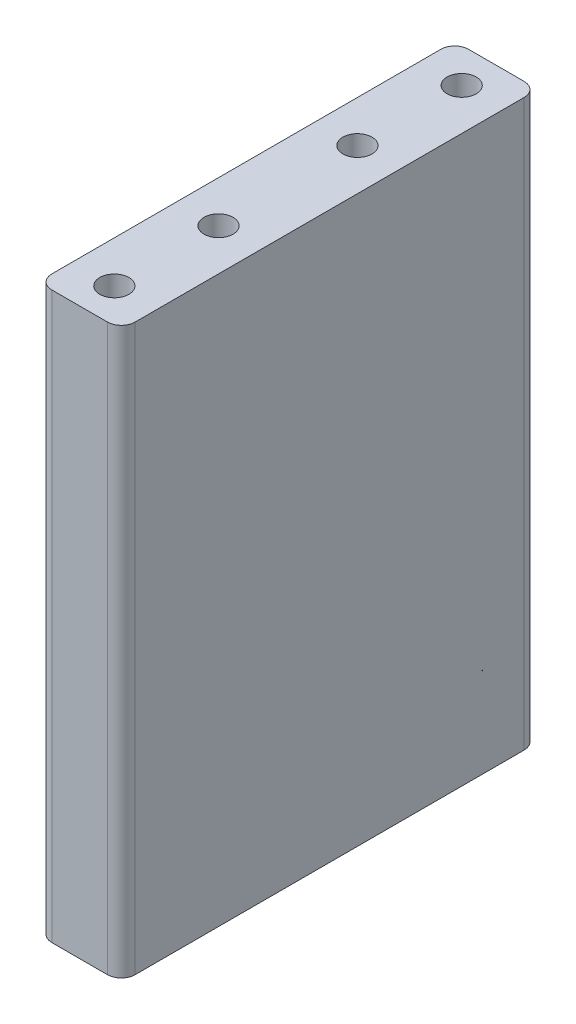
ISO-10303-21;
HEADER;
FILE_DESCRIPTION(('STEP AP214'),'2;1');
FILE_NAME('part.step','',(''),(''),'','','');
FILE_SCHEMA(('AUTOMOTIVE_DESIGN { 1 0 10303 214 1 1 1 1 }'));
ENDSEC;
DATA;
#1=APPLICATION_CONTEXT('core data for automotive mechanical design processes');
#2=APPLICATION_PROTOCOL_DEFINITION('international standard','automotive_design',2000,#1);
#3=PRODUCT_CONTEXT('',#1,'mechanical');
#4=PRODUCT('Part','Part','',(#3));
#5=PRODUCT_RELATED_PRODUCT_CATEGORY('part','',(#4));
#6=PRODUCT_DEFINITION_FORMATION('','',#4);
#7=PRODUCT_DEFINITION_CONTEXT('part definition',#1,'design');
#8=PRODUCT_DEFINITION('design','',#6,#7);
#9=PRODUCT_DEFINITION_SHAPE('','',#8);
#10=(LENGTH_UNIT() NAMED_UNIT(*) SI_UNIT(.MILLI.,.METRE.));
#11=(NAMED_UNIT(*) PLANE_ANGLE_UNIT() SI_UNIT($,.RADIAN.));
#12=(NAMED_UNIT(*) SI_UNIT($,.STERADIAN.) SOLID_ANGLE_UNIT());
#13=UNCERTAINTY_MEASURE_WITH_UNIT(LENGTH_MEASURE(1.E-05),#10,'distance_accuracy_value','');
#14=(GEOMETRIC_REPRESENTATION_CONTEXT(3) GLOBAL_UNCERTAINTY_ASSIGNED_CONTEXT((#13)) GLOBAL_UNIT_ASSIGNED_CONTEXT((#10,
#11,#12)) REPRESENTATION_CONTEXT('',''));
#15=CARTESIAN_POINT('',(0.,0.,0.));
#16=DIRECTION('',(0.,0.,1.));
#17=DIRECTION('',(1.,0.,0.));
#18=AXIS2_PLACEMENT_3D('',#15,#16,#17);
#19=CARTESIAN_POINT('',(-6.,-81.375,-30.));
#20=DIRECTION('',(0.,0.,1.));
#21=DIRECTION('',(1.,0.,0.));
#22=AXIS2_PLACEMENT_3D('',#19,#20,#21);
#23=PLANE('',#22);
#24=DIRECTION('',(1.,0.,0.));
#25=VECTOR('',#24,1.);
#26=CARTESIAN_POINT('',(-6.,-81.375,-30.));
#27=LINE('',#26,#25);
#28=CARTESIAN_POINT('',(-4.,-81.375,-30.));
#29=VERTEX_POINT('',#28);
#30=CARTESIAN_POINT('',(4.,-81.375,-30.));
#31=VERTEX_POINT('',#30);
#32=EDGE_CURVE('E125',#29,#31,#27,.T.);
#33=ORIENTED_EDGE('',*,*,#32,.F.);
#34=DIRECTION('',(0.,1.,0.));
#35=VECTOR('',#34,1.);
#36=CARTESIAN_POINT('',(-4.,0.,-30.));
#37=LINE('',#36,#35);
#38=CARTESIAN_POINT('',(-4.,0.,-30.));
#39=VERTEX_POINT('',#38);
#40=EDGE_CURVE('E109',#29,#39,#37,.T.);
#41=ORIENTED_EDGE('',*,*,#40,.T.);
#42=DIRECTION('',(1.,0.,0.));
#43=VECTOR('',#42,1.);
#44=CARTESIAN_POINT('',(-6.,0.,-30.));
#45=LINE('',#44,#43);
#46=CARTESIAN_POINT('',(4.,0.,-30.));
#47=VERTEX_POINT('',#46);
#48=EDGE_CURVE('E122',#39,#47,#45,.T.);
#49=ORIENTED_EDGE('',*,*,#48,.T.);
#50=DIRECTION('',(0.,1.,0.));
#51=VECTOR('',#50,1.);
#52=CARTESIAN_POINT('',(4.,-81.375,-30.));
#53=LINE('',#52,#51);
#54=EDGE_CURVE('E128',#47,#31,#53,.F.);
#55=ORIENTED_EDGE('',*,*,#54,.T.);
#56=EDGE_LOOP('',(#33,#41,#49,#55));
#57=FACE_BOUND('',#56,.T.);
#58=ADVANCED_FACE('F39',(#57),#23,.F.);
#59=CARTESIAN_POINT('',(6.,-81.375,-30.));
#60=DIRECTION('',(-1.,0.,0.));
#61=DIRECTION('',(0.,0.,1.));
#62=AXIS2_PLACEMENT_3D('',#59,#60,#61);
#63=PLANE('',#62);
#64=DIRECTION('',(0.,0.,1.));
#65=VECTOR('',#64,1.);
#66=CARTESIAN_POINT('',(6.,-81.375,-30.));
#67=LINE('',#66,#65);
#68=CARTESIAN_POINT('',(6.,-81.375,-28.));
#69=VERTEX_POINT('',#68);
#70=CARTESIAN_POINT('',(6.,-81.375,28.));
#71=VERTEX_POINT('',#70);
#72=EDGE_CURVE('E201',#69,#71,#67,.T.);
#73=ORIENTED_EDGE('',*,*,#72,.F.);
#74=DIRECTION('',(0.,1.,0.));
#75=VECTOR('',#74,1.);
#76=CARTESIAN_POINT('',(6.,-81.375,-28.));
#77=LINE('',#76,#75);
#78=CARTESIAN_POINT('',(6.,0.,-28.));
#79=VERTEX_POINT('',#78);
#80=EDGE_CURVE('E182',#69,#79,#77,.T.);
#81=ORIENTED_EDGE('',*,*,#80,.T.);
#82=DIRECTION('',(0.,0.,1.));
#83=VECTOR('',#82,1.);
#84=CARTESIAN_POINT('',(6.,0.,-30.));
#85=LINE('',#84,#83);
#86=CARTESIAN_POINT('',(6.,0.,28.));
#87=VERTEX_POINT('',#86);
#88=EDGE_CURVE('E133',#79,#87,#85,.T.);
#89=ORIENTED_EDGE('',*,*,#88,.T.);
#90=DIRECTION('',(0.,1.,0.));
#91=VECTOR('',#90,1.);
#92=CARTESIAN_POINT('',(6.,-81.375,28.));
#93=LINE('',#92,#91);
#94=EDGE_CURVE('E179',#87,#71,#93,.F.);
#95=ORIENTED_EDGE('',*,*,#94,.T.);
#96=EDGE_LOOP('',(#73,#81,#89,#95));
#97=FACE_BOUND('',#96,.T.);
#98=ADVANCED_FACE('F265',(#97),#63,.F.);
#99=CARTESIAN_POINT('',(-6.,-81.375,30.));
#100=DIRECTION('',(0.,0.,1.));
#101=DIRECTION('',(1.,0.,0.));
#102=AXIS2_PLACEMENT_3D('',#99,#100,#101);
#103=PLANE('',#102);
#104=DIRECTION('',(1.,0.,0.));
#105=VECTOR('',#104,1.);
#106=CARTESIAN_POINT('',(-6.,0.,30.));
#107=LINE('',#106,#105);
#108=CARTESIAN_POINT('',(-4.,0.,30.));
#109=VERTEX_POINT('',#108);
#110=CARTESIAN_POINT('',(4.,0.,30.));
#111=VERTEX_POINT('',#110);
#112=EDGE_CURVE('E139',#109,#111,#107,.T.);
#113=ORIENTED_EDGE('',*,*,#112,.F.);
#114=DIRECTION('',(0.,1.,0.));
#115=VECTOR('',#114,1.);
#116=CARTESIAN_POINT('',(-4.,-81.375,30.));
#117=LINE('',#116,#115);
#118=CARTESIAN_POINT('',(-4.,-81.375,30.));
#119=VERTEX_POINT('',#118);
#120=EDGE_CURVE('E11',#109,#119,#117,.F.);
#121=ORIENTED_EDGE('',*,*,#120,.T.);
#122=DIRECTION('',(1.,0.,0.));
#123=VECTOR('',#122,1.);
#124=CARTESIAN_POINT('',(-6.,-81.375,30.));
#125=LINE('',#124,#123);
#126=CARTESIAN_POINT('',(4.,-81.375,30.));
#127=VERTEX_POINT('',#126);
#128=EDGE_CURVE('E189',#119,#127,#125,.T.);
#129=ORIENTED_EDGE('',*,*,#128,.T.);
#130=DIRECTION('',(0.,1.,0.));
#131=VECTOR('',#130,1.);
#132=CARTESIAN_POINT('',(4.,0.,30.));
#133=LINE('',#132,#131);
#134=EDGE_CURVE('E48',#127,#111,#133,.T.);
#135=ORIENTED_EDGE('',*,*,#134,.T.);
#136=EDGE_LOOP('',(#113,#121,#129,#135));
#137=FACE_BOUND('',#136,.T.);
#138=ADVANCED_FACE('F188',(#137),#103,.T.);
#139=CARTESIAN_POINT('',(-6.,-81.375,-30.));
#140=DIRECTION('',(-1.,0.,0.));
#141=DIRECTION('',(0.,0.,1.));
#142=AXIS2_PLACEMENT_3D('',#139,#140,#141);
#143=PLANE('',#142);
#144=DIRECTION('',(0.,0.,1.));
#145=VECTOR('',#144,1.);
#146=CARTESIAN_POINT('',(-6.,0.,-30.));
#147=LINE('',#146,#145);
#148=CARTESIAN_POINT('',(-6.,0.,-28.));
#149=VERTEX_POINT('',#148);
#150=CARTESIAN_POINT('',(-6.,0.,28.));
#151=VERTEX_POINT('',#150);
#152=EDGE_CURVE('E151',#149,#151,#147,.T.);
#153=ORIENTED_EDGE('',*,*,#152,.F.);
#154=DIRECTION('',(0.,1.,0.));
#155=VECTOR('',#154,1.);
#156=CARTESIAN_POINT('',(-6.,-81.375,-28.));
#157=LINE('',#156,#155);
#158=CARTESIAN_POINT('',(-6.,-81.375,-28.));
#159=VERTEX_POINT('',#158);
#160=EDGE_CURVE('E110',#149,#159,#157,.F.);
#161=ORIENTED_EDGE('',*,*,#160,.T.);
#162=DIRECTION('',(0.,0.,1.));
#163=VECTOR('',#162,1.);
#164=CARTESIAN_POINT('',(-6.,-81.375,-30.));
#165=LINE('',#164,#163);
#166=CARTESIAN_POINT('',(-6.,-81.375,28.));
#167=VERTEX_POINT('',#166);
#168=EDGE_CURVE('E145',#159,#167,#165,.T.);
#169=ORIENTED_EDGE('',*,*,#168,.T.);
#170=DIRECTION('',(0.,1.,0.));
#171=VECTOR('',#170,1.);
#172=CARTESIAN_POINT('',(-6.,-81.375,28.));
#173=LINE('',#172,#171);
#174=EDGE_CURVE('E116',#167,#151,#173,.T.);
#175=ORIENTED_EDGE('',*,*,#174,.T.);
#176=EDGE_LOOP('',(#153,#161,#169,#175));
#177=FACE_BOUND('',#176,.T.);
#178=ADVANCED_FACE('F197',(#177),#143,.T.);
#179=CARTESIAN_POINT('',(0.,-81.375,0.));
#180=DIRECTION('',(0.,-1.,0.));
#181=DIRECTION('',(0.,0.,-1.));
#182=AXIS2_PLACEMENT_3D('',#179,#180,#181);
#183=PLANE('',#182);
#184=CARTESIAN_POINT('',(0.,-81.375,-10.));
#185=DIRECTION('',(0.,-1.,0.));
#186=DIRECTION('',(0.,0.,-1.));
#187=AXIS2_PLACEMENT_3D('',#184,#185,#186);
#188=CIRCLE('',#187,2.09999999999999);
#189=CARTESIAN_POINT('',(0.,-81.375,-12.1));
#190=VERTEX_POINT('',#189);
#191=EDGE_CURVE('E226',#190,#190,#188,.T.);
#192=ORIENTED_EDGE('',*,*,#191,.F.);
#193=EDGE_LOOP('',(#192));
#194=FACE_BOUND('',#193,.T.);
#195=CARTESIAN_POINT('',(0.,-81.375,10.));
#196=DIRECTION('',(0.,-1.,0.));
#197=DIRECTION('',(0.,0.,-1.));
#198=AXIS2_PLACEMENT_3D('',#195,#196,#197);
#199=CIRCLE('',#198,2.09999999999999);
#200=CARTESIAN_POINT('',(0.,-81.375,7.90000000000002));
#201=VERTEX_POINT('',#200);
#202=EDGE_CURVE('E218',#201,#201,#199,.T.);
#203=ORIENTED_EDGE('',*,*,#202,.F.);
#204=EDGE_LOOP('',(#203));
#205=FACE_BOUND('',#204,.T.);
#206=CARTESIAN_POINT('',(0.,-81.375,-25.));
#207=DIRECTION('',(0.,-1.,0.));
#208=DIRECTION('',(0.,0.,-1.));
#209=AXIS2_PLACEMENT_3D('',#206,#207,#208);
#210=CIRCLE('',#209,2.09999999999999);
#211=CARTESIAN_POINT('',(0.,-81.375,-27.1));
#212=VERTEX_POINT('',#211);
#213=EDGE_CURVE('E210',#212,#212,#210,.T.);
#214=ORIENTED_EDGE('',*,*,#213,.F.);
#215=EDGE_LOOP('',(#214));
#216=FACE_BOUND('',#215,.T.);
#217=CARTESIAN_POINT('',(0.,-81.375,25.));
#218=DIRECTION('',(0.,-1.,0.));
#219=DIRECTION('',(0.,0.,-1.));
#220=AXIS2_PLACEMENT_3D('',#217,#218,#219);
#221=CIRCLE('',#220,2.09999999999999);
#222=CARTESIAN_POINT('',(0.,-81.375,22.9));
#223=VERTEX_POINT('',#222);
#224=EDGE_CURVE('E134',#223,#223,#221,.T.);
#225=ORIENTED_EDGE('',*,*,#224,.F.);
#226=EDGE_LOOP('',(#225));
#227=FACE_BOUND('',#226,.T.);
#228=ORIENTED_EDGE('',*,*,#168,.F.);
#229=CARTESIAN_POINT('',(-4.,-81.375,-28.));
#230=DIRECTION('',(0.,-1.,0.));
#231=DIRECTION('',(0.,0.,-1.));
#232=AXIS2_PLACEMENT_3D('',#229,#230,#231);
#233=CIRCLE('',#232,2.);
#234=EDGE_CURVE('E176',#159,#29,#233,.T.);
#235=ORIENTED_EDGE('',*,*,#234,.T.);
#236=ORIENTED_EDGE('',*,*,#32,.T.);
#237=CARTESIAN_POINT('',(4.,-81.375,-28.));
#238=DIRECTION('',(0.,-1.,0.));
#239=DIRECTION('',(0.,0.,-1.));
#240=AXIS2_PLACEMENT_3D('',#237,#238,#239);
#241=CIRCLE('',#240,2.);
#242=EDGE_CURVE('E173',#31,#69,#241,.T.);
#243=ORIENTED_EDGE('',*,*,#242,.T.);
#244=ORIENTED_EDGE('',*,*,#72,.T.);
#245=CARTESIAN_POINT('',(4.,-81.375,28.));
#246=DIRECTION('',(0.,-1.,0.));
#247=DIRECTION('',(0.,0.,-1.));
#248=AXIS2_PLACEMENT_3D('',#245,#246,#247);
#249=CIRCLE('',#248,2.);
#250=EDGE_CURVE('E55',#71,#127,#249,.T.);
#251=ORIENTED_EDGE('',*,*,#250,.T.);
#252=ORIENTED_EDGE('',*,*,#128,.F.);
#253=CARTESIAN_POINT('',(-4.,-81.375,28.));
#254=DIRECTION('',(0.,-1.,0.));
#255=DIRECTION('',(0.,0.,-1.));
#256=AXIS2_PLACEMENT_3D('',#253,#254,#255);
#257=CIRCLE('',#256,2.);
#258=EDGE_CURVE('E170',#119,#167,#257,.T.);
#259=ORIENTED_EDGE('',*,*,#258,.T.);
#260=EDGE_LOOP('',(#228,#235,#236,#243,#244,#251,#252,#259));
#261=FACE_BOUND('',#260,.T.);
#262=ADVANCED_FACE('F241',(#194,#205,#216,#227,#261),#183,.T.);
#263=CARTESIAN_POINT('',(0.,0.,0.));
#264=DIRECTION('',(0.,-1.,0.));
#265=DIRECTION('',(0.,0.,-1.));
#266=AXIS2_PLACEMENT_3D('',#263,#264,#265);
#267=PLANE('',#266);
#268=CARTESIAN_POINT('',(0.,0.,-10.));
#269=DIRECTION('',(0.,1.,0.));
#270=DIRECTION('',(0.,0.,1.));
#271=AXIS2_PLACEMENT_3D('',#268,#269,#270);
#272=CIRCLE('',#271,2.09999999999999);
#273=CARTESIAN_POINT('',(0.,0.,-7.90000000000001));
#274=VERTEX_POINT('',#273);
#275=EDGE_CURVE('E230',#274,#274,#272,.T.);
#276=ORIENTED_EDGE('',*,*,#275,.F.);
#277=EDGE_LOOP('',(#276));
#278=FACE_BOUND('',#277,.T.);
#279=CARTESIAN_POINT('',(0.,0.,10.));
#280=DIRECTION('',(0.,1.,0.));
#281=DIRECTION('',(0.,0.,1.));
#282=AXIS2_PLACEMENT_3D('',#279,#280,#281);
#283=CIRCLE('',#282,2.09999999999999);
#284=CARTESIAN_POINT('',(0.,0.,12.1));
#285=VERTEX_POINT('',#284);
#286=EDGE_CURVE('E222',#285,#285,#283,.T.);
#287=ORIENTED_EDGE('',*,*,#286,.F.);
#288=EDGE_LOOP('',(#287));
#289=FACE_BOUND('',#288,.T.);
#290=CARTESIAN_POINT('',(0.,0.,-25.));
#291=DIRECTION('',(0.,1.,0.));
#292=DIRECTION('',(0.,0.,1.));
#293=AXIS2_PLACEMENT_3D('',#290,#291,#292);
#294=CIRCLE('',#293,2.09999999999999);
#295=CARTESIAN_POINT('',(0.,0.,-22.9));
#296=VERTEX_POINT('',#295);
#297=EDGE_CURVE('E214',#296,#296,#294,.T.);
#298=ORIENTED_EDGE('',*,*,#297,.F.);
#299=EDGE_LOOP('',(#298));
#300=FACE_BOUND('',#299,.T.);
#301=CARTESIAN_POINT('',(0.,0.,25.));
#302=DIRECTION('',(0.,1.,0.));
#303=DIRECTION('',(0.,0.,1.));
#304=AXIS2_PLACEMENT_3D('',#301,#302,#303);
#305=CIRCLE('',#304,2.09999999999999);
#306=CARTESIAN_POINT('',(0.,0.,27.1));
#307=VERTEX_POINT('',#306);
#308=EDGE_CURVE('E142',#307,#307,#305,.T.);
#309=ORIENTED_EDGE('',*,*,#308,.F.);
#310=EDGE_LOOP('',(#309));
#311=FACE_BOUND('',#310,.T.);
#312=ORIENTED_EDGE('',*,*,#48,.F.);
#313=CARTESIAN_POINT('',(-4.,0.,-28.));
#314=DIRECTION('',(0.,-1.,0.));
#315=DIRECTION('',(0.,0.,-1.));
#316=AXIS2_PLACEMENT_3D('',#313,#314,#315);
#317=CIRCLE('',#316,2.);
#318=EDGE_CURVE('E105',#39,#149,#317,.F.);
#319=ORIENTED_EDGE('',*,*,#318,.T.);
#320=ORIENTED_EDGE('',*,*,#152,.T.);
#321=CARTESIAN_POINT('',(-4.,0.,28.));
#322=DIRECTION('',(0.,-1.,0.));
#323=DIRECTION('',(0.,0.,-1.));
#324=AXIS2_PLACEMENT_3D('',#321,#322,#323);
#325=CIRCLE('',#324,2.);
#326=EDGE_CURVE('E158',#151,#109,#325,.F.);
#327=ORIENTED_EDGE('',*,*,#326,.T.);
#328=ORIENTED_EDGE('',*,*,#112,.T.);
#329=CARTESIAN_POINT('',(4.,0.,28.));
#330=DIRECTION('',(0.,-1.,0.));
#331=DIRECTION('',(0.,0.,-1.));
#332=AXIS2_PLACEMENT_3D('',#329,#330,#331);
#333=CIRCLE('',#332,2.);
#334=EDGE_CURVE('E127',#111,#87,#333,.F.);
#335=ORIENTED_EDGE('',*,*,#334,.T.);
#336=ORIENTED_EDGE('',*,*,#88,.F.);
#337=CARTESIAN_POINT('',(4.,0.,-28.));
#338=DIRECTION('',(0.,-1.,0.));
#339=DIRECTION('',(0.,0.,-1.));
#340=AXIS2_PLACEMENT_3D('',#337,#338,#339);
#341=CIRCLE('',#340,2.);
#342=EDGE_CURVE('E117',#79,#47,#341,.F.);
#343=ORIENTED_EDGE('',*,*,#342,.T.);
#344=EDGE_LOOP('',(#312,#319,#320,#327,#328,#335,#336,#343));
#345=FACE_BOUND('',#344,.T.);
#346=ADVANCED_FACE('F130',(#278,#289,#300,#311,#345),#267,.F.);
#347=CARTESIAN_POINT('',(0.,0.,25.));
#348=DIRECTION('',(0.,1.,0.));
#349=DIRECTION('',(0.,0.,1.));
#350=AXIS2_PLACEMENT_3D('',#347,#348,#349);
#351=CYLINDRICAL_SURFACE('',#350,2.09999999999999);
#352=ORIENTED_EDGE('',*,*,#308,.T.);
#353=EDGE_LOOP('',(#352));
#354=FACE_BOUND('',#353,.T.);
#355=ORIENTED_EDGE('',*,*,#224,.T.);
#356=EDGE_LOOP('',(#355));
#357=FACE_BOUND('',#356,.T.);
#358=ADVANCED_FACE('F240',(#354,#357),#351,.F.);
#359=CARTESIAN_POINT('',(0.,0.,-25.));
#360=DIRECTION('',(0.,1.,0.));
#361=DIRECTION('',(0.,0.,1.));
#362=AXIS2_PLACEMENT_3D('',#359,#360,#361);
#363=CYLINDRICAL_SURFACE('',#362,2.09999999999999);
#364=ORIENTED_EDGE('',*,*,#297,.T.);
#365=EDGE_LOOP('',(#364));
#366=FACE_BOUND('',#365,.T.);
#367=ORIENTED_EDGE('',*,*,#213,.T.);
#368=EDGE_LOOP('',(#367));
#369=FACE_BOUND('',#368,.T.);
#370=ADVANCED_FACE('F251',(#366,#369),#363,.F.);
#371=CARTESIAN_POINT('',(0.,0.,10.));
#372=DIRECTION('',(0.,1.,0.));
#373=DIRECTION('',(0.,0.,1.));
#374=AXIS2_PLACEMENT_3D('',#371,#372,#373);
#375=CYLINDRICAL_SURFACE('',#374,2.09999999999999);
#376=ORIENTED_EDGE('',*,*,#286,.T.);
#377=EDGE_LOOP('',(#376));
#378=FACE_BOUND('',#377,.T.);
#379=ORIENTED_EDGE('',*,*,#202,.T.);
#380=EDGE_LOOP('',(#379));
#381=FACE_BOUND('',#380,.T.);
#382=ADVANCED_FACE('F348',(#378,#381),#375,.F.);
#383=CARTESIAN_POINT('',(0.,0.,-10.));
#384=DIRECTION('',(0.,1.,0.));
#385=DIRECTION('',(0.,0.,1.));
#386=AXIS2_PLACEMENT_3D('',#383,#384,#385);
#387=CYLINDRICAL_SURFACE('',#386,2.09999999999999);
#388=ORIENTED_EDGE('',*,*,#275,.T.);
#389=EDGE_LOOP('',(#388));
#390=FACE_BOUND('',#389,.T.);
#391=ORIENTED_EDGE('',*,*,#191,.T.);
#392=EDGE_LOOP('',(#391));
#393=FACE_BOUND('',#392,.T.);
#394=ADVANCED_FACE('F235',(#390,#393),#387,.F.);
#395=CARTESIAN_POINT('',(-4.,-81.375,-28.));
#396=DIRECTION('',(0.,-1.,0.));
#397=DIRECTION('',(0.,0.,-1.));
#398=AXIS2_PLACEMENT_3D('',#395,#396,#397);
#399=CYLINDRICAL_SURFACE('',#398,2.);
#400=ORIENTED_EDGE('',*,*,#234,.F.);
#401=ORIENTED_EDGE('',*,*,#160,.F.);
#402=ORIENTED_EDGE('',*,*,#318,.F.);
#403=ORIENTED_EDGE('',*,*,#40,.F.);
#404=EDGE_LOOP('',(#400,#401,#402,#403));
#405=FACE_BOUND('',#404,.T.);
#406=ADVANCED_FACE('F108',(#405),#399,.T.);
#407=CARTESIAN_POINT('',(4.,-81.375,-28.));
#408=DIRECTION('',(0.,1.,0.));
#409=DIRECTION('',(0.,0.,1.));
#410=AXIS2_PLACEMENT_3D('',#407,#408,#409);
#411=CYLINDRICAL_SURFACE('',#410,2.);
#412=ORIENTED_EDGE('',*,*,#242,.F.);
#413=ORIENTED_EDGE('',*,*,#54,.F.);
#414=ORIENTED_EDGE('',*,*,#342,.F.);
#415=ORIENTED_EDGE('',*,*,#80,.F.);
#416=EDGE_LOOP('',(#412,#413,#414,#415));
#417=FACE_BOUND('',#416,.T.);
#418=ADVANCED_FACE('F276',(#417),#411,.T.);
#419=CARTESIAN_POINT('',(-4.,-81.375,28.));
#420=DIRECTION('',(0.,1.,0.));
#421=DIRECTION('',(0.,0.,1.));
#422=AXIS2_PLACEMENT_3D('',#419,#420,#421);
#423=CYLINDRICAL_SURFACE('',#422,2.);
#424=ORIENTED_EDGE('',*,*,#258,.F.);
#425=ORIENTED_EDGE('',*,*,#120,.F.);
#426=ORIENTED_EDGE('',*,*,#326,.F.);
#427=ORIENTED_EDGE('',*,*,#174,.F.);
#428=EDGE_LOOP('',(#424,#425,#426,#427));
#429=FACE_BOUND('',#428,.T.);
#430=ADVANCED_FACE('F194',(#429),#423,.T.);
#431=CARTESIAN_POINT('',(4.,-81.375,28.));
#432=DIRECTION('',(0.,-1.,0.));
#433=DIRECTION('',(0.,0.,-1.));
#434=AXIS2_PLACEMENT_3D('',#431,#432,#433);
#435=CYLINDRICAL_SURFACE('',#434,2.);
#436=ORIENTED_EDGE('',*,*,#250,.F.);
#437=ORIENTED_EDGE('',*,*,#94,.F.);
#438=ORIENTED_EDGE('',*,*,#334,.F.);
#439=ORIENTED_EDGE('',*,*,#134,.F.);
#440=EDGE_LOOP('',(#436,#437,#438,#439));
#441=FACE_BOUND('',#440,.T.);
#442=ADVANCED_FACE('F41',(#441),#435,.T.);
#443=CLOSED_SHELL('',(#58,#98,#138,#178,#262,#346,#358,#370,#382,#394,#406,#418,#430,#442));
#444=MANIFOLD_SOLID_BREP('B2',#443);
#445=ADVANCED_BREP_SHAPE_REPRESENTATION('',(#18,#444),#14);
#446=SHAPE_DEFINITION_REPRESENTATION(#9,#445);
ENDSEC;
END-ISO-10303-21;
